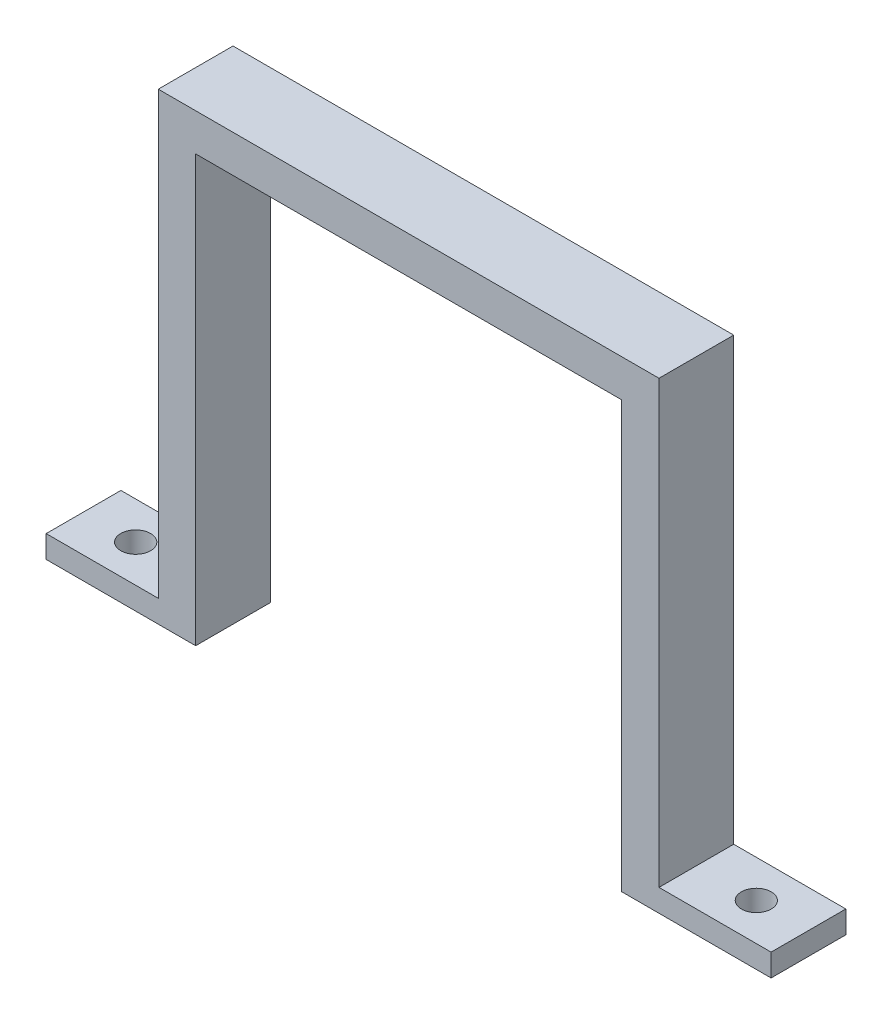
ISO-10303-21;
HEADER;
FILE_DESCRIPTION(('STEP AP214'),'2;1');
FILE_NAME('part.step','',(''),(''),'','','');
FILE_SCHEMA(('AUTOMOTIVE_DESIGN { 1 0 10303 214 1 1 1 1 }'));
ENDSEC;
DATA;
#1=APPLICATION_CONTEXT('core data for automotive mechanical design processes');
#2=APPLICATION_PROTOCOL_DEFINITION('international standard','automotive_design',2000,#1);
#3=PRODUCT_CONTEXT('',#1,'mechanical');
#4=PRODUCT('Part','Part','',(#3));
#5=PRODUCT_RELATED_PRODUCT_CATEGORY('part','',(#4));
#6=PRODUCT_DEFINITION_FORMATION('','',#4);
#7=PRODUCT_DEFINITION_CONTEXT('part definition',#1,'design');
#8=PRODUCT_DEFINITION('design','',#6,#7);
#9=PRODUCT_DEFINITION_SHAPE('','',#8);
#10=(LENGTH_UNIT() NAMED_UNIT(*) SI_UNIT(.MILLI.,.METRE.));
#11=(NAMED_UNIT(*) PLANE_ANGLE_UNIT() SI_UNIT($,.RADIAN.));
#12=(NAMED_UNIT(*) SI_UNIT($,.STERADIAN.) SOLID_ANGLE_UNIT());
#13=UNCERTAINTY_MEASURE_WITH_UNIT(LENGTH_MEASURE(1.E-05),#10,'distance_accuracy_value','');
#14=(GEOMETRIC_REPRESENTATION_CONTEXT(3) GLOBAL_UNCERTAINTY_ASSIGNED_CONTEXT((#13)) GLOBAL_UNIT_ASSIGNED_CONTEXT((#10,
#11,#12)) REPRESENTATION_CONTEXT('',''));
#15=CARTESIAN_POINT('',(0.,0.,0.));
#16=DIRECTION('',(0.,0.,1.));
#17=DIRECTION('',(1.,0.,0.));
#18=AXIS2_PLACEMENT_3D('',#15,#16,#17);
#19=CARTESIAN_POINT('',(-28.5,57.,10.));
#20=DIRECTION('',(-1.,0.,0.));
#21=DIRECTION('',(0.,-1.,0.));
#22=AXIS2_PLACEMENT_3D('',#19,#20,#21);
#23=PLANE('',#22);
#24=DIRECTION('',(0.,1.,0.));
#25=VECTOR('',#24,1.);
#26=CARTESIAN_POINT('',(-28.5,57.,0.));
#27=LINE('',#26,#25);
#28=CARTESIAN_POINT('',(-28.5,0.,0.));
#29=VERTEX_POINT('',#28);
#30=CARTESIAN_POINT('',(-28.5,57.,0.));
#31=VERTEX_POINT('',#30);
#32=EDGE_CURVE('E169',#29,#31,#27,.T.);
#33=ORIENTED_EDGE('',*,*,#32,.T.);
#34=DIRECTION('',(0.,0.,-1.));
#35=VECTOR('',#34,1.);
#36=CARTESIAN_POINT('',(-28.5,57.,10.));
#37=LINE('',#36,#35);
#38=CARTESIAN_POINT('',(-28.5,57.,10.));
#39=VERTEX_POINT('',#38);
#40=EDGE_CURVE('E11',#39,#31,#37,.T.);
#41=ORIENTED_EDGE('',*,*,#40,.F.);
#42=DIRECTION('',(0.,1.,0.));
#43=VECTOR('',#42,1.);
#44=CARTESIAN_POINT('',(-28.5,57.,10.));
#45=LINE('',#44,#43);
#46=CARTESIAN_POINT('',(-28.5,0.,10.));
#47=VERTEX_POINT('',#46);
#48=EDGE_CURVE('E204',#47,#39,#45,.T.);
#49=ORIENTED_EDGE('',*,*,#48,.F.);
#50=DIRECTION('',(0.,0.,-1.));
#51=VECTOR('',#50,1.);
#52=CARTESIAN_POINT('',(-28.5,0.,10.));
#53=LINE('',#52,#51);
#54=EDGE_CURVE('E165',#47,#29,#53,.T.);
#55=ORIENTED_EDGE('',*,*,#54,.T.);
#56=EDGE_LOOP('',(#33,#41,#49,#55));
#57=FACE_BOUND('',#56,.T.);
#58=ADVANCED_FACE('F43',(#57),#23,.F.);
#59=CARTESIAN_POINT('',(28.5,57.,10.));
#60=DIRECTION('',(0.,1.,0.));
#61=DIRECTION('',(0.,0.,1.));
#62=AXIS2_PLACEMENT_3D('',#59,#60,#61);
#63=PLANE('',#62);
#64=DIRECTION('',(1.,0.,0.));
#65=VECTOR('',#64,1.);
#66=CARTESIAN_POINT('',(28.5,57.,0.));
#67=LINE('',#66,#65);
#68=CARTESIAN_POINT('',(28.5,57.,0.));
#69=VERTEX_POINT('',#68);
#70=EDGE_CURVE('E173',#31,#69,#67,.T.);
#71=ORIENTED_EDGE('',*,*,#70,.T.);
#72=DIRECTION('',(0.,0.,-1.));
#73=VECTOR('',#72,1.);
#74=CARTESIAN_POINT('',(28.5,57.,10.));
#75=LINE('',#74,#73);
#76=CARTESIAN_POINT('',(28.5,57.,10.));
#77=VERTEX_POINT('',#76);
#78=EDGE_CURVE('E53',#77,#69,#75,.T.);
#79=ORIENTED_EDGE('',*,*,#78,.F.);
#80=DIRECTION('',(1.,0.,0.));
#81=VECTOR('',#80,1.);
#82=CARTESIAN_POINT('',(28.5,57.,10.));
#83=LINE('',#82,#81);
#84=EDGE_CURVE('E116',#39,#77,#83,.T.);
#85=ORIENTED_EDGE('',*,*,#84,.F.);
#86=ORIENTED_EDGE('',*,*,#40,.T.);
#87=EDGE_LOOP('',(#71,#79,#85,#86));
#88=FACE_BOUND('',#87,.T.);
#89=ADVANCED_FACE('F300',(#88),#63,.F.);
#90=CARTESIAN_POINT('',(28.5,57.,10.));
#91=DIRECTION('',(1.,0.,0.));
#92=DIRECTION('',(0.,1.,0.));
#93=AXIS2_PLACEMENT_3D('',#90,#91,#92);
#94=PLANE('',#93);
#95=DIRECTION('',(0.,-1.,0.));
#96=VECTOR('',#95,1.);
#97=CARTESIAN_POINT('',(28.5,57.,0.));
#98=LINE('',#97,#96);
#99=CARTESIAN_POINT('',(28.5,0.,0.));
#100=VERTEX_POINT('',#99);
#101=EDGE_CURVE('E176',#69,#100,#98,.T.);
#102=ORIENTED_EDGE('',*,*,#101,.T.);
#103=DIRECTION('',(0.,0.,-1.));
#104=VECTOR('',#103,1.);
#105=CARTESIAN_POINT('',(28.5,0.,10.));
#106=LINE('',#105,#104);
#107=CARTESIAN_POINT('',(28.5,0.,10.));
#108=VERTEX_POINT('',#107);
#109=EDGE_CURVE('E231',#108,#100,#106,.T.);
#110=ORIENTED_EDGE('',*,*,#109,.F.);
#111=DIRECTION('',(0.,-1.,0.));
#112=VECTOR('',#111,1.);
#113=CARTESIAN_POINT('',(28.5,57.,10.));
#114=LINE('',#113,#112);
#115=EDGE_CURVE('E242',#77,#108,#114,.T.);
#116=ORIENTED_EDGE('',*,*,#115,.F.);
#117=ORIENTED_EDGE('',*,*,#78,.T.);
#118=EDGE_LOOP('',(#102,#110,#116,#117));
#119=FACE_BOUND('',#118,.T.);
#120=ADVANCED_FACE('F240',(#119),#94,.F.);
#121=CARTESIAN_POINT('',(28.5,0.,10.));
#122=DIRECTION('',(0.,1.,0.));
#123=DIRECTION('',(-1.,0.,0.));
#124=AXIS2_PLACEMENT_3D('',#121,#122,#123);
#125=PLANE('',#124);
#126=CARTESIAN_POINT('',(41.5223606557377,0.,5.));
#127=DIRECTION('',(0.,1.,0.));
#128=DIRECTION('',(0.,0.,1.));
#129=AXIS2_PLACEMENT_3D('',#126,#127,#128);
#130=CIRCLE('',#129,2.);
#131=CARTESIAN_POINT('',(41.5223606557377,0.,7.));
#132=VERTEX_POINT('',#131);
#133=EDGE_CURVE('E335',#132,#132,#130,.T.);
#134=ORIENTED_EDGE('',*,*,#133,.T.);
#135=EDGE_LOOP('',(#134));
#136=FACE_BOUND('',#135,.T.);
#137=DIRECTION('',(1.,0.,0.));
#138=VECTOR('',#137,1.);
#139=CARTESIAN_POINT('',(28.5,0.,0.));
#140=LINE('',#139,#138);
#141=CARTESIAN_POINT('',(48.5,0.,0.));
#142=VERTEX_POINT('',#141);
#143=EDGE_CURVE('E179',#100,#142,#140,.T.);
#144=ORIENTED_EDGE('',*,*,#143,.T.);
#145=DIRECTION('',(0.,0.,-1.));
#146=VECTOR('',#145,1.);
#147=CARTESIAN_POINT('',(48.5,0.,10.));
#148=LINE('',#147,#146);
#149=CARTESIAN_POINT('',(48.5,0.,10.));
#150=VERTEX_POINT('',#149);
#151=EDGE_CURVE('E227',#150,#142,#148,.T.);
#152=ORIENTED_EDGE('',*,*,#151,.F.);
#153=DIRECTION('',(1.,0.,0.));
#154=VECTOR('',#153,1.);
#155=CARTESIAN_POINT('',(28.5,0.,10.));
#156=LINE('',#155,#154);
#157=EDGE_CURVE('E261',#108,#150,#156,.T.);
#158=ORIENTED_EDGE('',*,*,#157,.F.);
#159=ORIENTED_EDGE('',*,*,#109,.T.);
#160=EDGE_LOOP('',(#144,#152,#158,#159));
#161=FACE_BOUND('',#160,.T.);
#162=ADVANCED_FACE('F251',(#136,#161),#125,.F.);
#163=CARTESIAN_POINT('',(48.5,3.,10.));
#164=DIRECTION('',(-1.,0.,0.));
#165=DIRECTION('',(0.,0.,1.));
#166=AXIS2_PLACEMENT_3D('',#163,#164,#165);
#167=PLANE('',#166);
#168=DIRECTION('',(0.,1.,0.));
#169=VECTOR('',#168,1.);
#170=CARTESIAN_POINT('',(48.5,3.,0.));
#171=LINE('',#170,#169);
#172=CARTESIAN_POINT('',(48.5,3.,0.));
#173=VERTEX_POINT('',#172);
#174=EDGE_CURVE('E182',#142,#173,#171,.T.);
#175=ORIENTED_EDGE('',*,*,#174,.T.);
#176=DIRECTION('',(0.,0.,-1.));
#177=VECTOR('',#176,1.);
#178=CARTESIAN_POINT('',(48.5,3.,10.));
#179=LINE('',#178,#177);
#180=CARTESIAN_POINT('',(48.5,3.,10.));
#181=VERTEX_POINT('',#180);
#182=EDGE_CURVE('E223',#181,#173,#179,.T.);
#183=ORIENTED_EDGE('',*,*,#182,.F.);
#184=DIRECTION('',(0.,1.,0.));
#185=VECTOR('',#184,1.);
#186=CARTESIAN_POINT('',(48.5,3.,10.));
#187=LINE('',#186,#185);
#188=EDGE_CURVE('E257',#150,#181,#187,.T.);
#189=ORIENTED_EDGE('',*,*,#188,.F.);
#190=ORIENTED_EDGE('',*,*,#151,.T.);
#191=EDGE_LOOP('',(#175,#183,#189,#190));
#192=FACE_BOUND('',#191,.T.);
#193=ADVANCED_FACE('F255',(#192),#167,.F.);
#194=CARTESIAN_POINT('',(48.5,3.,10.));
#195=DIRECTION('',(0.,-1.,0.));
#196=DIRECTION('',(1.,0.,0.));
#197=AXIS2_PLACEMENT_3D('',#194,#195,#196);
#198=PLANE('',#197);
#199=CARTESIAN_POINT('',(41.5223606557377,3.,5.));
#200=DIRECTION('',(0.,-1.,0.));
#201=DIRECTION('',(1.,0.,0.));
#202=AXIS2_PLACEMENT_3D('',#199,#200,#201);
#203=CIRCLE('',#202,2.);
#204=CARTESIAN_POINT('',(43.5223606557377,3.,5.));
#205=VERTEX_POINT('',#204);
#206=EDGE_CURVE('E46',#205,#205,#203,.F.);
#207=ORIENTED_EDGE('',*,*,#206,.F.);
#208=EDGE_LOOP('',(#207));
#209=FACE_BOUND('',#208,.T.);
#210=DIRECTION('',(-1.,0.,0.));
#211=VECTOR('',#210,1.);
#212=CARTESIAN_POINT('',(48.5,3.,0.));
#213=LINE('',#212,#211);
#214=CARTESIAN_POINT('',(33.5,3.,0.));
#215=VERTEX_POINT('',#214);
#216=EDGE_CURVE('E185',#173,#215,#213,.T.);
#217=ORIENTED_EDGE('',*,*,#216,.T.);
#218=DIRECTION('',(0.,0.,-1.));
#219=VECTOR('',#218,1.);
#220=CARTESIAN_POINT('',(33.5,3.,10.));
#221=LINE('',#220,#219);
#222=CARTESIAN_POINT('',(33.5,3.,10.));
#223=VERTEX_POINT('',#222);
#224=EDGE_CURVE('E219',#223,#215,#221,.T.);
#225=ORIENTED_EDGE('',*,*,#224,.F.);
#226=DIRECTION('',(-1.,0.,0.));
#227=VECTOR('',#226,1.);
#228=CARTESIAN_POINT('',(48.5,3.,10.));
#229=LINE('',#228,#227);
#230=EDGE_CURVE('E260',#181,#223,#229,.T.);
#231=ORIENTED_EDGE('',*,*,#230,.F.);
#232=ORIENTED_EDGE('',*,*,#182,.T.);
#233=EDGE_LOOP('',(#217,#225,#231,#232));
#234=FACE_BOUND('',#233,.T.);
#235=ADVANCED_FACE('F314',(#209,#234),#198,.F.);
#236=CARTESIAN_POINT('',(33.5,62.,10.));
#237=DIRECTION('',(-1.,0.,0.));
#238=DIRECTION('',(0.,-1.,0.));
#239=AXIS2_PLACEMENT_3D('',#236,#237,#238);
#240=PLANE('',#239);
#241=DIRECTION('',(0.,1.,0.));
#242=VECTOR('',#241,1.);
#243=CARTESIAN_POINT('',(33.5,62.,0.));
#244=LINE('',#243,#242);
#245=CARTESIAN_POINT('',(33.5,62.,0.));
#246=VERTEX_POINT('',#245);
#247=EDGE_CURVE('E188',#215,#246,#244,.T.);
#248=ORIENTED_EDGE('',*,*,#247,.T.);
#249=DIRECTION('',(0.,0.,-1.));
#250=VECTOR('',#249,1.);
#251=CARTESIAN_POINT('',(33.5,62.,10.));
#252=LINE('',#251,#250);
#253=CARTESIAN_POINT('',(33.5,62.,10.));
#254=VERTEX_POINT('',#253);
#255=EDGE_CURVE('E215',#254,#246,#252,.T.);
#256=ORIENTED_EDGE('',*,*,#255,.F.);
#257=DIRECTION('',(0.,1.,0.));
#258=VECTOR('',#257,1.);
#259=CARTESIAN_POINT('',(33.5,62.,10.));
#260=LINE('',#259,#258);
#261=EDGE_CURVE('E265',#223,#254,#260,.T.);
#262=ORIENTED_EDGE('',*,*,#261,.F.);
#263=ORIENTED_EDGE('',*,*,#224,.T.);
#264=EDGE_LOOP('',(#248,#256,#262,#263));
#265=FACE_BOUND('',#264,.T.);
#266=ADVANCED_FACE('F317',(#265),#240,.F.);
#267=CARTESIAN_POINT('',(-33.4761547540984,62.,10.));
#268=DIRECTION('',(0.,-1.,0.));
#269=DIRECTION('',(0.,0.,-1.));
#270=AXIS2_PLACEMENT_3D('',#267,#268,#269);
#271=PLANE('',#270);
#272=DIRECTION('',(-1.,0.,0.));
#273=VECTOR('',#272,1.);
#274=CARTESIAN_POINT('',(-33.4761547540984,62.,0.));
#275=LINE('',#274,#273);
#276=CARTESIAN_POINT('',(-33.5,62.,0.));
#277=VERTEX_POINT('',#276);
#278=EDGE_CURVE('E192',#246,#277,#275,.T.);
#279=ORIENTED_EDGE('',*,*,#278,.T.);
#280=DIRECTION('',(0.,0.,-1.));
#281=VECTOR('',#280,1.);
#282=CARTESIAN_POINT('',(-33.5,62.,10.));
#283=LINE('',#282,#281);
#284=CARTESIAN_POINT('',(-33.5,62.,10.));
#285=VERTEX_POINT('',#284);
#286=EDGE_CURVE('E211',#285,#277,#283,.T.);
#287=ORIENTED_EDGE('',*,*,#286,.F.);
#288=DIRECTION('',(-1.,0.,0.));
#289=VECTOR('',#288,1.);
#290=CARTESIAN_POINT('',(33.4761547540984,62.,10.));
#291=LINE('',#290,#289);
#292=EDGE_CURVE('E272',#254,#285,#291,.T.);
#293=ORIENTED_EDGE('',*,*,#292,.F.);
#294=ORIENTED_EDGE('',*,*,#255,.T.);
#295=EDGE_LOOP('',(#279,#287,#293,#294));
#296=FACE_BOUND('',#295,.T.);
#297=ADVANCED_FACE('F280',(#296),#271,.F.);
#298=CARTESIAN_POINT('',(-33.5,62.,10.));
#299=DIRECTION('',(1.,0.,0.));
#300=DIRECTION('',(0.,1.,0.));
#301=AXIS2_PLACEMENT_3D('',#298,#299,#300);
#302=PLANE('',#301);
#303=DIRECTION('',(0.,-1.,0.));
#304=VECTOR('',#303,1.);
#305=CARTESIAN_POINT('',(-33.5,62.,0.));
#306=LINE('',#305,#304);
#307=CARTESIAN_POINT('',(-33.5,3.,0.));
#308=VERTEX_POINT('',#307);
#309=EDGE_CURVE('E195',#277,#308,#306,.T.);
#310=ORIENTED_EDGE('',*,*,#309,.T.);
#311=DIRECTION('',(0.,0.,-1.));
#312=VECTOR('',#311,1.);
#313=CARTESIAN_POINT('',(-33.5,3.,10.));
#314=LINE('',#313,#312);
#315=CARTESIAN_POINT('',(-33.5,3.,10.));
#316=VERTEX_POINT('',#315);
#317=EDGE_CURVE('E158',#316,#308,#314,.T.);
#318=ORIENTED_EDGE('',*,*,#317,.F.);
#319=DIRECTION('',(0.,-1.,0.));
#320=VECTOR('',#319,1.);
#321=CARTESIAN_POINT('',(-33.5,62.,10.));
#322=LINE('',#321,#320);
#323=EDGE_CURVE('E147',#285,#316,#322,.T.);
#324=ORIENTED_EDGE('',*,*,#323,.F.);
#325=ORIENTED_EDGE('',*,*,#286,.T.);
#326=EDGE_LOOP('',(#310,#318,#324,#325));
#327=FACE_BOUND('',#326,.T.);
#328=ADVANCED_FACE('F283',(#327),#302,.F.);
#329=CARTESIAN_POINT('',(-48.5,3.,10.));
#330=DIRECTION('',(0.,-1.,0.));
#331=DIRECTION('',(1.,0.,0.));
#332=AXIS2_PLACEMENT_3D('',#329,#330,#331);
#333=PLANE('',#332);
#334=CARTESIAN_POINT('',(-41.5223606557377,3.,5.));
#335=DIRECTION('',(0.,-1.,0.));
#336=DIRECTION('',(1.,0.,0.));
#337=AXIS2_PLACEMENT_3D('',#334,#335,#336);
#338=CIRCLE('',#337,2.);
#339=CARTESIAN_POINT('',(-39.5223606557377,3.,5.));
#340=VERTEX_POINT('',#339);
#341=EDGE_CURVE('E332',#340,#340,#338,.F.);
#342=ORIENTED_EDGE('',*,*,#341,.F.);
#343=EDGE_LOOP('',(#342));
#344=FACE_BOUND('',#343,.T.);
#345=DIRECTION('',(-1.,0.,0.));
#346=VECTOR('',#345,1.);
#347=CARTESIAN_POINT('',(-48.5,3.,0.));
#348=LINE('',#347,#346);
#349=CARTESIAN_POINT('',(-48.5,3.,0.));
#350=VERTEX_POINT('',#349);
#351=EDGE_CURVE('E156',#308,#350,#348,.T.);
#352=ORIENTED_EDGE('',*,*,#351,.T.);
#353=DIRECTION('',(0.,0.,-1.));
#354=VECTOR('',#353,1.);
#355=CARTESIAN_POINT('',(-48.5,3.,10.));
#356=LINE('',#355,#354);
#357=CARTESIAN_POINT('',(-48.5,3.,10.));
#358=VERTEX_POINT('',#357);
#359=EDGE_CURVE('E153',#358,#350,#356,.T.);
#360=ORIENTED_EDGE('',*,*,#359,.F.);
#361=DIRECTION('',(-1.,0.,0.));
#362=VECTOR('',#361,1.);
#363=CARTESIAN_POINT('',(-48.5,3.,10.));
#364=LINE('',#363,#362);
#365=EDGE_CURVE('E141',#316,#358,#364,.T.);
#366=ORIENTED_EDGE('',*,*,#365,.F.);
#367=ORIENTED_EDGE('',*,*,#317,.T.);
#368=EDGE_LOOP('',(#352,#360,#366,#367));
#369=FACE_BOUND('',#368,.T.);
#370=ADVANCED_FACE('F154',(#344,#369),#333,.F.);
#371=CARTESIAN_POINT('',(-48.5,3.,10.));
#372=DIRECTION('',(1.,0.,0.));
#373=DIRECTION('',(0.,0.,-1.));
#374=AXIS2_PLACEMENT_3D('',#371,#372,#373);
#375=PLANE('',#374);
#376=DIRECTION('',(0.,-1.,0.));
#377=VECTOR('',#376,1.);
#378=CARTESIAN_POINT('',(-48.5,3.,0.));
#379=LINE('',#378,#377);
#380=CARTESIAN_POINT('',(-48.5,0.,0.));
#381=VERTEX_POINT('',#380);
#382=EDGE_CURVE('E102',#350,#381,#379,.T.);
#383=ORIENTED_EDGE('',*,*,#382,.T.);
#384=DIRECTION('',(0.,0.,-1.));
#385=VECTOR('',#384,1.);
#386=CARTESIAN_POINT('',(-48.5,0.,10.));
#387=LINE('',#386,#385);
#388=CARTESIAN_POINT('',(-48.5,0.,10.));
#389=VERTEX_POINT('',#388);
#390=EDGE_CURVE('E159',#389,#381,#387,.T.);
#391=ORIENTED_EDGE('',*,*,#390,.F.);
#392=DIRECTION('',(0.,-1.,0.));
#393=VECTOR('',#392,1.);
#394=CARTESIAN_POINT('',(-48.5,3.,10.));
#395=LINE('',#394,#393);
#396=EDGE_CURVE('E145',#358,#389,#395,.T.);
#397=ORIENTED_EDGE('',*,*,#396,.F.);
#398=ORIENTED_EDGE('',*,*,#359,.T.);
#399=EDGE_LOOP('',(#383,#391,#397,#398));
#400=FACE_BOUND('',#399,.T.);
#401=ADVANCED_FACE('F161',(#400),#375,.F.);
#402=CARTESIAN_POINT('',(-28.5,0.,10.));
#403=DIRECTION('',(0.,1.,0.));
#404=DIRECTION('',(-1.,0.,0.));
#405=AXIS2_PLACEMENT_3D('',#402,#403,#404);
#406=PLANE('',#405);
#407=CARTESIAN_POINT('',(-41.5223606557377,0.,5.));
#408=DIRECTION('',(0.,1.,0.));
#409=DIRECTION('',(0.,0.,1.));
#410=AXIS2_PLACEMENT_3D('',#407,#408,#409);
#411=CIRCLE('',#410,2.);
#412=CARTESIAN_POINT('',(-41.5223606557377,0.,7.));
#413=VERTEX_POINT('',#412);
#414=EDGE_CURVE('E341',#413,#413,#411,.T.);
#415=ORIENTED_EDGE('',*,*,#414,.T.);
#416=EDGE_LOOP('',(#415));
#417=FACE_BOUND('',#416,.T.);
#418=DIRECTION('',(1.,0.,0.));
#419=VECTOR('',#418,1.);
#420=CARTESIAN_POINT('',(-28.5,0.,0.));
#421=LINE('',#420,#419);
#422=EDGE_CURVE('E108',#381,#29,#421,.T.);
#423=ORIENTED_EDGE('',*,*,#422,.T.);
#424=ORIENTED_EDGE('',*,*,#54,.F.);
#425=DIRECTION('',(1.,0.,0.));
#426=VECTOR('',#425,1.);
#427=CARTESIAN_POINT('',(-28.5,0.,10.));
#428=LINE('',#427,#426);
#429=EDGE_CURVE('E61',#389,#47,#428,.T.);
#430=ORIENTED_EDGE('',*,*,#429,.F.);
#431=ORIENTED_EDGE('',*,*,#390,.T.);
#432=EDGE_LOOP('',(#423,#424,#430,#431));
#433=FACE_BOUND('',#432,.T.);
#434=ADVANCED_FACE('F287',(#417,#433),#406,.F.);
#435=CARTESIAN_POINT('',(0.,0.,10.));
#436=DIRECTION('',(0.,0.,-1.));
#437=DIRECTION('',(-1.,0.,0.));
#438=AXIS2_PLACEMENT_3D('',#435,#436,#437);
#439=PLANE('',#438);
#440=ORIENTED_EDGE('',*,*,#48,.T.);
#441=ORIENTED_EDGE('',*,*,#84,.T.);
#442=ORIENTED_EDGE('',*,*,#115,.T.);
#443=ORIENTED_EDGE('',*,*,#157,.T.);
#444=ORIENTED_EDGE('',*,*,#188,.T.);
#445=ORIENTED_EDGE('',*,*,#230,.T.);
#446=ORIENTED_EDGE('',*,*,#261,.T.);
#447=ORIENTED_EDGE('',*,*,#292,.T.);
#448=ORIENTED_EDGE('',*,*,#323,.T.);
#449=ORIENTED_EDGE('',*,*,#365,.T.);
#450=ORIENTED_EDGE('',*,*,#396,.T.);
#451=ORIENTED_EDGE('',*,*,#429,.T.);
#452=EDGE_LOOP('',(#440,#441,#442,#443,#444,#445,#446,#447,#448,#449,#450,#451));
#453=FACE_BOUND('',#452,.T.);
#454=ADVANCED_FACE('F143',(#453),#439,.F.);
#455=CARTESIAN_POINT('',(0.,0.,0.));
#456=DIRECTION('',(0.,0.,-1.));
#457=DIRECTION('',(-1.,0.,0.));
#458=AXIS2_PLACEMENT_3D('',#455,#456,#457);
#459=PLANE('',#458);
#460=ORIENTED_EDGE('',*,*,#32,.F.);
#461=ORIENTED_EDGE('',*,*,#422,.F.);
#462=ORIENTED_EDGE('',*,*,#382,.F.);
#463=ORIENTED_EDGE('',*,*,#351,.F.);
#464=ORIENTED_EDGE('',*,*,#309,.F.);
#465=ORIENTED_EDGE('',*,*,#278,.F.);
#466=ORIENTED_EDGE('',*,*,#247,.F.);
#467=ORIENTED_EDGE('',*,*,#216,.F.);
#468=ORIENTED_EDGE('',*,*,#174,.F.);
#469=ORIENTED_EDGE('',*,*,#143,.F.);
#470=ORIENTED_EDGE('',*,*,#101,.F.);
#471=ORIENTED_EDGE('',*,*,#70,.F.);
#472=EDGE_LOOP('',(#460,#461,#462,#463,#464,#465,#466,#467,#468,#469,#470,#471));
#473=FACE_BOUND('',#472,.T.);
#474=ADVANCED_FACE('F246',(#473),#459,.T.);
#475=CARTESIAN_POINT('',(-41.5223606557377,10.,5.));
#476=DIRECTION('',(0.,-1.,0.));
#477=DIRECTION('',(0.,0.,-1.));
#478=AXIS2_PLACEMENT_3D('',#475,#476,#477);
#479=CYLINDRICAL_SURFACE('',#478,2.);
#480=ORIENTED_EDGE('',*,*,#414,.F.);
#481=EDGE_LOOP('',(#480));
#482=FACE_BOUND('',#481,.T.);
#483=ORIENTED_EDGE('',*,*,#341,.T.);
#484=EDGE_LOOP('',(#483));
#485=FACE_BOUND('',#484,.T.);
#486=ADVANCED_FACE('F352',(#482,#485),#479,.F.);
#487=CARTESIAN_POINT('',(41.5223606557377,10.,5.));
#488=DIRECTION('',(0.,-1.,0.));
#489=DIRECTION('',(0.,0.,-1.));
#490=AXIS2_PLACEMENT_3D('',#487,#488,#489);
#491=CYLINDRICAL_SURFACE('',#490,2.);
#492=ORIENTED_EDGE('',*,*,#133,.F.);
#493=EDGE_LOOP('',(#492));
#494=FACE_BOUND('',#493,.T.);
#495=ORIENTED_EDGE('',*,*,#206,.T.);
#496=EDGE_LOOP('',(#495));
#497=FACE_BOUND('',#496,.T.);
#498=ADVANCED_FACE('F354',(#494,#497),#491,.F.);
#499=CLOSED_SHELL('',(#58,#89,#120,#162,#193,#235,#266,#297,#328,#370,#401,#434,#454,#474,#486,#498));
#500=MANIFOLD_SOLID_BREP('B2',#499);
#501=ADVANCED_BREP_SHAPE_REPRESENTATION('',(#18,#500),#14);
#502=SHAPE_DEFINITION_REPRESENTATION(#9,#501);
ENDSEC;
END-ISO-10303-21;
